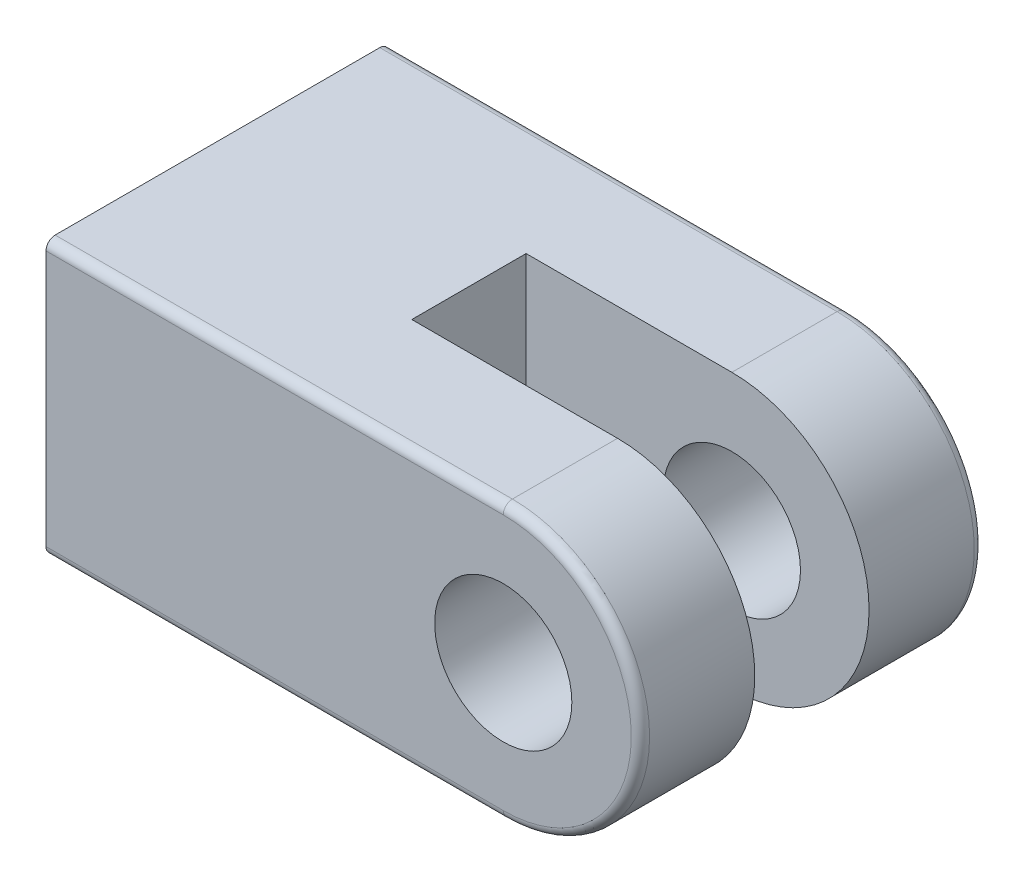
ISO-10303-21;
HEADER;
FILE_DESCRIPTION(('STEP AP214'),'2;1');
FILE_NAME('part.step','',(''),(''),'','','');
FILE_SCHEMA(('AUTOMOTIVE_DESIGN { 1 0 10303 214 1 1 1 1 }'));
ENDSEC;
DATA;
#1=APPLICATION_CONTEXT('core data for automotive mechanical design processes');
#2=APPLICATION_PROTOCOL_DEFINITION('international standard','automotive_design',2000,#1);
#3=PRODUCT_CONTEXT('',#1,'mechanical');
#4=PRODUCT('Part','Part','',(#3));
#5=PRODUCT_RELATED_PRODUCT_CATEGORY('part','',(#4));
#6=PRODUCT_DEFINITION_FORMATION('','',#4);
#7=PRODUCT_DEFINITION_CONTEXT('part definition',#1,'design');
#8=PRODUCT_DEFINITION('design','',#6,#7);
#9=PRODUCT_DEFINITION_SHAPE('','',#8);
#10=(LENGTH_UNIT() NAMED_UNIT(*) SI_UNIT(.MILLI.,.METRE.));
#11=(NAMED_UNIT(*) PLANE_ANGLE_UNIT() SI_UNIT($,.RADIAN.));
#12=(NAMED_UNIT(*) SI_UNIT($,.STERADIAN.) SOLID_ANGLE_UNIT());
#13=UNCERTAINTY_MEASURE_WITH_UNIT(LENGTH_MEASURE(1.E-05),#10,'distance_accuracy_value','');
#14=(GEOMETRIC_REPRESENTATION_CONTEXT(3) GLOBAL_UNCERTAINTY_ASSIGNED_CONTEXT((#13)) GLOBAL_UNIT_ASSIGNED_CONTEXT((#10,
#11,#12)) REPRESENTATION_CONTEXT('',''));
#15=CARTESIAN_POINT('',(0.,0.,0.));
#16=DIRECTION('',(0.,0.,1.));
#17=DIRECTION('',(1.,0.,0.));
#18=AXIS2_PLACEMENT_3D('',#15,#16,#17);
#19=CARTESIAN_POINT('',(0.,0.,19.05));
#20=DIRECTION('',(0.,0.,-1.));
#21=DIRECTION('',(-1.,0.,0.));
#22=AXIS2_PLACEMENT_3D('',#19,#20,#21);
#23=CYLINDRICAL_SURFACE('',#22,7.62);
#24=DIRECTION('',(0.,0.,-1.));
#25=VECTOR('',#24,1.);
#26=CARTESIAN_POINT('',(0.,7.62,19.05));
#27=LINE('',#26,#25);
#28=CARTESIAN_POINT('',(0.,7.62,18.542));
#29=VERTEX_POINT('',#28);
#30=CARTESIAN_POINT('',(0.,7.62,12.7));
#31=VERTEX_POINT('',#30);
#32=EDGE_CURVE('E193',#29,#31,#27,.T.);
#33=ORIENTED_EDGE('',*,*,#32,.F.);
#34=CARTESIAN_POINT('',(0.,0.,18.542));
#35=DIRECTION('',(0.,0.,1.));
#36=DIRECTION('',(1.,0.,0.));
#37=AXIS2_PLACEMENT_3D('',#34,#35,#36);
#38=CIRCLE('',#37,7.62);
#39=CARTESIAN_POINT('',(0.,-7.62,18.542));
#40=VERTEX_POINT('',#39);
#41=EDGE_CURVE('E13',#29,#40,#38,.F.);
#42=ORIENTED_EDGE('',*,*,#41,.T.);
#43=DIRECTION('',(0.,0.,-1.));
#44=VECTOR('',#43,1.);
#45=CARTESIAN_POINT('',(0.,-7.62,19.05));
#46=LINE('',#45,#44);
#47=CARTESIAN_POINT('',(0.,-7.62,12.7));
#48=VERTEX_POINT('',#47);
#49=EDGE_CURVE('E184',#40,#48,#46,.T.);
#50=ORIENTED_EDGE('',*,*,#49,.T.);
#51=CARTESIAN_POINT('',(0.,0.,12.7));
#52=DIRECTION('',(0.,0.,1.));
#53=DIRECTION('',(1.,0.,0.));
#54=AXIS2_PLACEMENT_3D('',#51,#52,#53);
#55=CIRCLE('',#54,7.62);
#56=EDGE_CURVE('E174',#48,#31,#55,.T.);
#57=ORIENTED_EDGE('',*,*,#56,.T.);
#58=EDGE_LOOP('',(#33,#42,#50,#57));
#59=FACE_BOUND('',#58,.T.);
#60=ADVANCED_FACE('F47',(#59),#23,.T.);
#61=CARTESIAN_POINT('',(0.,-7.62,6.35));
#62=VERTEX_POINT('',#61);
#63=CARTESIAN_POINT('',(0.,-7.62,0.508000000000008));
#64=VERTEX_POINT('',#63);
#65=EDGE_CURVE('E181',#62,#64,#46,.T.);
#66=ORIENTED_EDGE('',*,*,#65,.T.);
#67=CARTESIAN_POINT('',(0.,0.,0.508000000000002));
#68=DIRECTION('',(0.,0.,1.));
#69=DIRECTION('',(1.,0.,0.));
#70=AXIS2_PLACEMENT_3D('',#67,#68,#69);
#71=CIRCLE('',#70,7.62);
#72=CARTESIAN_POINT('',(0.,7.62,0.508000000000008));
#73=VERTEX_POINT('',#72);
#74=EDGE_CURVE('E56',#64,#73,#71,.T.);
#75=ORIENTED_EDGE('',*,*,#74,.T.);
#76=CARTESIAN_POINT('',(0.,7.62,6.35));
#77=VERTEX_POINT('',#76);
#78=EDGE_CURVE('E192',#77,#73,#27,.T.);
#79=ORIENTED_EDGE('',*,*,#78,.F.);
#80=CARTESIAN_POINT('',(0.,0.,6.35));
#81=DIRECTION('',(0.,0.,-1.));
#82=DIRECTION('',(-1.,0.,0.));
#83=AXIS2_PLACEMENT_3D('',#80,#81,#82);
#84=CIRCLE('',#83,7.62);
#85=EDGE_CURVE('E145',#77,#62,#84,.T.);
#86=ORIENTED_EDGE('',*,*,#85,.T.);
#87=EDGE_LOOP('',(#66,#75,#79,#86));
#88=FACE_BOUND('',#87,.T.);
#89=ADVANCED_FACE('F265',(#88),#23,.T.);
#90=CARTESIAN_POINT('',(0.,7.62,19.05));
#91=DIRECTION('',(0.,-1.,0.));
#92=DIRECTION('',(1.,0.,0.));
#93=AXIS2_PLACEMENT_3D('',#90,#91,#92);
#94=PLANE('',#93);
#95=ORIENTED_EDGE('',*,*,#78,.T.);
#96=DIRECTION('',(-1.,0.,0.));
#97=VECTOR('',#96,1.);
#98=CARTESIAN_POINT('',(0.,7.62,0.508000000000002));
#99=LINE('',#98,#97);
#100=CARTESIAN_POINT('',(-25.4,7.62,0.508000000000008));
#101=VERTEX_POINT('',#100);
#102=EDGE_CURVE('E222',#73,#101,#99,.T.);
#103=ORIENTED_EDGE('',*,*,#102,.T.);
#104=DIRECTION('',(0.,0.,-1.));
#105=VECTOR('',#104,1.);
#106=CARTESIAN_POINT('',(-25.4,7.62,19.05));
#107=LINE('',#106,#105);
#108=CARTESIAN_POINT('',(-25.4,7.62,18.542));
#109=VERTEX_POINT('',#108);
#110=EDGE_CURVE('E189',#109,#101,#107,.T.);
#111=ORIENTED_EDGE('',*,*,#110,.F.);
#112=DIRECTION('',(-1.,0.,0.));
#113=VECTOR('',#112,1.);
#114=CARTESIAN_POINT('',(0.,7.62,18.542));
#115=LINE('',#114,#113);
#116=EDGE_CURVE('E220',#109,#29,#115,.F.);
#117=ORIENTED_EDGE('',*,*,#116,.T.);
#118=ORIENTED_EDGE('',*,*,#32,.T.);
#119=DIRECTION('',(1.,0.,0.));
#120=VECTOR('',#119,1.);
#121=CARTESIAN_POINT('',(-11.43,7.62,12.7));
#122=LINE('',#121,#120);
#123=CARTESIAN_POINT('',(-11.43,7.62,12.7));
#124=VERTEX_POINT('',#123);
#125=EDGE_CURVE('E164',#124,#31,#122,.T.);
#126=ORIENTED_EDGE('',*,*,#125,.F.);
#127=DIRECTION('',(0.,0.,1.));
#128=VECTOR('',#127,1.);
#129=CARTESIAN_POINT('',(-11.43,7.62,6.35));
#130=LINE('',#129,#128);
#131=CARTESIAN_POINT('',(-11.43,7.62,6.35));
#132=VERTEX_POINT('',#131);
#133=EDGE_CURVE('E150',#132,#124,#130,.T.);
#134=ORIENTED_EDGE('',*,*,#133,.F.);
#135=DIRECTION('',(-1.,0.,0.));
#136=VECTOR('',#135,1.);
#137=CARTESIAN_POINT('',(7.62,7.62,6.35));
#138=LINE('',#137,#136);
#139=EDGE_CURVE('E139',#77,#132,#138,.T.);
#140=ORIENTED_EDGE('',*,*,#139,.F.);
#141=EDGE_LOOP('',(#95,#103,#111,#117,#118,#126,#134,#140));
#142=FACE_BOUND('',#141,.T.);
#143=ADVANCED_FACE('F162',(#142),#94,.F.);
#144=CARTESIAN_POINT('',(-25.4,7.62,19.05));
#145=DIRECTION('',(1.,0.,0.));
#146=DIRECTION('',(0.,0.,-1.));
#147=AXIS2_PLACEMENT_3D('',#144,#145,#146);
#148=PLANE('',#147);
#149=DIRECTION('',(0.,-1.,0.));
#150=VECTOR('',#149,1.);
#151=CARTESIAN_POINT('',(-25.4,7.62,0.));
#152=LINE('',#151,#150);
#153=CARTESIAN_POINT('',(-25.4,7.112,0.));
#154=VERTEX_POINT('',#153);
#155=CARTESIAN_POINT('',(-25.4,-7.112,0.));
#156=VERTEX_POINT('',#155);
#157=EDGE_CURVE('E177',#154,#156,#152,.T.);
#158=ORIENTED_EDGE('',*,*,#157,.T.);
#159=CARTESIAN_POINT('',(-25.4,-7.112,0.508000000000002));
#160=DIRECTION('',(1.,0.,0.));
#161=DIRECTION('',(0.,0.,-1.));
#162=AXIS2_PLACEMENT_3D('',#159,#160,#161);
#163=CIRCLE('',#162,0.508);
#164=CARTESIAN_POINT('',(-25.4,-7.62,0.508000000000008));
#165=VERTEX_POINT('',#164);
#166=EDGE_CURVE('E218',#156,#165,#163,.F.);
#167=ORIENTED_EDGE('',*,*,#166,.T.);
#168=DIRECTION('',(0.,0.,-1.));
#169=VECTOR('',#168,1.);
#170=CARTESIAN_POINT('',(-25.4,-7.62,19.05));
#171=LINE('',#170,#169);
#172=CARTESIAN_POINT('',(-25.4,-7.62,18.542));
#173=VERTEX_POINT('',#172);
#174=EDGE_CURVE('E186',#173,#165,#171,.T.);
#175=ORIENTED_EDGE('',*,*,#174,.F.);
#176=CARTESIAN_POINT('',(-25.4,-7.112,18.542));
#177=DIRECTION('',(1.,0.,0.));
#178=DIRECTION('',(0.,0.,-1.));
#179=AXIS2_PLACEMENT_3D('',#176,#177,#178);
#180=CIRCLE('',#179,0.508);
#181=CARTESIAN_POINT('',(-25.4,-7.112,19.05));
#182=VERTEX_POINT('',#181);
#183=EDGE_CURVE('E214',#173,#182,#180,.F.);
#184=ORIENTED_EDGE('',*,*,#183,.T.);
#185=DIRECTION('',(0.,-1.,0.));
#186=VECTOR('',#185,1.);
#187=CARTESIAN_POINT('',(-25.4,7.62,19.05));
#188=LINE('',#187,#186);
#189=CARTESIAN_POINT('',(-25.4,7.112,19.05));
#190=VERTEX_POINT('',#189);
#191=EDGE_CURVE('E178',#190,#182,#188,.T.);
#192=ORIENTED_EDGE('',*,*,#191,.F.);
#193=CARTESIAN_POINT('',(-25.4,7.112,18.542));
#194=DIRECTION('',(1.,0.,0.));
#195=DIRECTION('',(0.,0.,-1.));
#196=AXIS2_PLACEMENT_3D('',#193,#194,#195);
#197=CIRCLE('',#196,0.508);
#198=EDGE_CURVE('E212',#190,#109,#197,.F.);
#199=ORIENTED_EDGE('',*,*,#198,.T.);
#200=ORIENTED_EDGE('',*,*,#110,.T.);
#201=CARTESIAN_POINT('',(-25.4,7.112,0.508000000000002));
#202=DIRECTION('',(1.,0.,0.));
#203=DIRECTION('',(0.,0.,-1.));
#204=AXIS2_PLACEMENT_3D('',#201,#202,#203);
#205=CIRCLE('',#204,0.508);
#206=EDGE_CURVE('E216',#101,#154,#205,.F.);
#207=ORIENTED_EDGE('',*,*,#206,.T.);
#208=EDGE_LOOP('',(#158,#167,#175,#184,#192,#199,#200,#207));
#209=FACE_BOUND('',#208,.T.);
#210=ADVANCED_FACE('F247',(#209),#148,.F.);
#211=CARTESIAN_POINT('',(-25.4,-7.62,19.05));
#212=DIRECTION('',(0.,1.,0.));
#213=DIRECTION('',(0.,0.,1.));
#214=AXIS2_PLACEMENT_3D('',#211,#212,#213);
#215=PLANE('',#214);
#216=ORIENTED_EDGE('',*,*,#174,.T.);
#217=DIRECTION('',(1.,0.,0.));
#218=VECTOR('',#217,1.);
#219=CARTESIAN_POINT('',(-25.4,-7.62,0.508000000000002));
#220=LINE('',#219,#218);
#221=EDGE_CURVE('E203',#165,#64,#220,.T.);
#222=ORIENTED_EDGE('',*,*,#221,.T.);
#223=ORIENTED_EDGE('',*,*,#65,.F.);
#224=DIRECTION('',(-1.,0.,0.));
#225=VECTOR('',#224,1.);
#226=CARTESIAN_POINT('',(-25.4,-7.62,6.35));
#227=LINE('',#226,#225);
#228=CARTESIAN_POINT('',(-11.43,-7.62,6.35));
#229=VERTEX_POINT('',#228);
#230=EDGE_CURVE('E195',#62,#229,#227,.T.);
#231=ORIENTED_EDGE('',*,*,#230,.T.);
#232=DIRECTION('',(0.,0.,1.));
#233=VECTOR('',#232,1.);
#234=CARTESIAN_POINT('',(-11.43,-7.62,6.35));
#235=LINE('',#234,#233);
#236=CARTESIAN_POINT('',(-11.43,-7.62,12.7));
#237=VERTEX_POINT('',#236);
#238=EDGE_CURVE('E158',#229,#237,#235,.T.);
#239=ORIENTED_EDGE('',*,*,#238,.T.);
#240=DIRECTION('',(1.,0.,0.));
#241=VECTOR('',#240,1.);
#242=CARTESIAN_POINT('',(-11.43,-7.62,12.7));
#243=LINE('',#242,#241);
#244=EDGE_CURVE('E160',#237,#48,#243,.T.);
#245=ORIENTED_EDGE('',*,*,#244,.T.);
#246=ORIENTED_EDGE('',*,*,#49,.F.);
#247=DIRECTION('',(1.,0.,0.));
#248=VECTOR('',#247,1.);
#249=CARTESIAN_POINT('',(-25.4,-7.62,18.542));
#250=LINE('',#249,#248);
#251=EDGE_CURVE('E197',#40,#173,#250,.F.);
#252=ORIENTED_EDGE('',*,*,#251,.T.);
#253=EDGE_LOOP('',(#216,#222,#223,#231,#239,#245,#246,#252));
#254=FACE_BOUND('',#253,.T.);
#255=ADVANCED_FACE('F254',(#254),#215,.F.);
#256=CARTESIAN_POINT('',(0.,0.,19.05));
#257=DIRECTION('',(0.,0.,1.));
#258=DIRECTION('',(1.,0.,0.));
#259=AXIS2_PLACEMENT_3D('',#256,#257,#258);
#260=PLANE('',#259);
#261=ORIENTED_EDGE('',*,*,#191,.T.);
#262=DIRECTION('',(1.,0.,0.));
#263=VECTOR('',#262,1.);
#264=CARTESIAN_POINT('',(0.,-7.112,19.05));
#265=LINE('',#264,#263);
#266=CARTESIAN_POINT('',(0.,-7.112,19.05));
#267=VERTEX_POINT('',#266);
#268=EDGE_CURVE('E227',#182,#267,#265,.T.);
#269=ORIENTED_EDGE('',*,*,#268,.T.);
#270=CARTESIAN_POINT('',(0.,0.,19.05));
#271=DIRECTION('',(0.,0.,1.));
#272=DIRECTION('',(1.,0.,0.));
#273=AXIS2_PLACEMENT_3D('',#270,#271,#272);
#274=CIRCLE('',#273,7.112);
#275=CARTESIAN_POINT('',(0.,7.112,19.05));
#276=VERTEX_POINT('',#275);
#277=EDGE_CURVE('E64',#267,#276,#274,.T.);
#278=ORIENTED_EDGE('',*,*,#277,.T.);
#279=DIRECTION('',(-1.,0.,0.));
#280=VECTOR('',#279,1.);
#281=CARTESIAN_POINT('',(-25.4,7.112,19.05));
#282=LINE('',#281,#280);
#283=EDGE_CURVE('E225',#276,#190,#282,.T.);
#284=ORIENTED_EDGE('',*,*,#283,.T.);
#285=EDGE_LOOP('',(#261,#269,#278,#284));
#286=FACE_BOUND('',#285,.T.);
#287=CARTESIAN_POINT('',(0.,0.,19.05));
#288=DIRECTION('',(0.,0.,1.));
#289=DIRECTION('',(1.,0.,0.));
#290=AXIS2_PLACEMENT_3D('',#287,#288,#289);
#291=CIRCLE('',#290,3.81);
#292=CARTESIAN_POINT('',(3.81,0.,19.05));
#293=VERTEX_POINT('',#292);
#294=EDGE_CURVE('E234',#293,#293,#291,.T.);
#295=ORIENTED_EDGE('',*,*,#294,.F.);
#296=EDGE_LOOP('',(#295));
#297=FACE_BOUND('',#296,.T.);
#298=ADVANCED_FACE('F244',(#286,#297),#260,.T.);
#299=CARTESIAN_POINT('',(0.,0.,0.));
#300=DIRECTION('',(0.,0.,1.));
#301=DIRECTION('',(1.,0.,0.));
#302=AXIS2_PLACEMENT_3D('',#299,#300,#301);
#303=PLANE('',#302);
#304=CARTESIAN_POINT('',(0.,0.,0.));
#305=DIRECTION('',(0.,0.,1.));
#306=DIRECTION('',(1.,0.,0.));
#307=AXIS2_PLACEMENT_3D('',#304,#305,#306);
#308=CIRCLE('',#307,3.81);
#309=CARTESIAN_POINT('',(3.81,0.,0.));
#310=VERTEX_POINT('',#309);
#311=EDGE_CURVE('E201',#310,#310,#308,.T.);
#312=ORIENTED_EDGE('',*,*,#311,.T.);
#313=EDGE_LOOP('',(#312));
#314=FACE_BOUND('',#313,.T.);
#315=CARTESIAN_POINT('',(0.,0.,0.));
#316=DIRECTION('',(0.,0.,1.));
#317=DIRECTION('',(1.,0.,0.));
#318=AXIS2_PLACEMENT_3D('',#315,#316,#317);
#319=CIRCLE('',#318,7.112);
#320=CARTESIAN_POINT('',(0.,7.112,0.));
#321=VERTEX_POINT('',#320);
#322=CARTESIAN_POINT('',(0.,-7.112,0.));
#323=VERTEX_POINT('',#322);
#324=EDGE_CURVE('E206',#321,#323,#319,.F.);
#325=ORIENTED_EDGE('',*,*,#324,.T.);
#326=DIRECTION('',(1.,0.,0.));
#327=VECTOR('',#326,1.);
#328=CARTESIAN_POINT('',(0.,-7.112,0.));
#329=LINE('',#328,#327);
#330=EDGE_CURVE('E210',#323,#156,#329,.F.);
#331=ORIENTED_EDGE('',*,*,#330,.T.);
#332=ORIENTED_EDGE('',*,*,#157,.F.);
#333=DIRECTION('',(-1.,0.,0.));
#334=VECTOR('',#333,1.);
#335=CARTESIAN_POINT('',(0.,7.112,0.));
#336=LINE('',#335,#334);
#337=EDGE_CURVE('E208',#154,#321,#336,.F.);
#338=ORIENTED_EDGE('',*,*,#337,.T.);
#339=EDGE_LOOP('',(#325,#331,#332,#338));
#340=FACE_BOUND('',#339,.T.);
#341=ADVANCED_FACE('F279',(#314,#340),#303,.F.);
#342=CARTESIAN_POINT('',(-11.43,-7.62,12.7));
#343=DIRECTION('',(0.,0.,1.));
#344=DIRECTION('',(1.,0.,0.));
#345=AXIS2_PLACEMENT_3D('',#342,#343,#344);
#346=PLANE('',#345);
#347=CARTESIAN_POINT('',(0.,0.,12.7));
#348=DIRECTION('',(0.,0.,1.));
#349=DIRECTION('',(1.,0.,0.));
#350=AXIS2_PLACEMENT_3D('',#347,#348,#349);
#351=CIRCLE('',#350,3.81);
#352=CARTESIAN_POINT('',(3.81,0.,12.7));
#353=VERTEX_POINT('',#352);
#354=EDGE_CURVE('E151',#353,#353,#351,.T.);
#355=ORIENTED_EDGE('',*,*,#354,.T.);
#356=EDGE_LOOP('',(#355));
#357=FACE_BOUND('',#356,.T.);
#358=ORIENTED_EDGE('',*,*,#56,.F.);
#359=ORIENTED_EDGE('',*,*,#244,.F.);
#360=DIRECTION('',(0.,1.,0.));
#361=VECTOR('',#360,1.);
#362=CARTESIAN_POINT('',(-11.43,-7.62,12.7));
#363=LINE('',#362,#361);
#364=EDGE_CURVE('E159',#237,#124,#363,.T.);
#365=ORIENTED_EDGE('',*,*,#364,.T.);
#366=ORIENTED_EDGE('',*,*,#125,.T.);
#367=EDGE_LOOP('',(#358,#359,#365,#366));
#368=FACE_BOUND('',#367,.T.);
#369=ADVANCED_FACE('F261',(#357,#368),#346,.F.);
#370=CARTESIAN_POINT('',(7.62,-7.62,6.35));
#371=DIRECTION('',(0.,0.,-1.));
#372=DIRECTION('',(-1.,0.,0.));
#373=AXIS2_PLACEMENT_3D('',#370,#371,#372);
#374=PLANE('',#373);
#375=CARTESIAN_POINT('',(0.,0.,6.35));
#376=DIRECTION('',(0.,0.,-1.));
#377=DIRECTION('',(-1.,0.,0.));
#378=AXIS2_PLACEMENT_3D('',#375,#376,#377);
#379=CIRCLE('',#378,3.81);
#380=CARTESIAN_POINT('',(3.81,0.,6.35));
#381=VERTEX_POINT('',#380);
#382=EDGE_CURVE('E198',#381,#381,#379,.T.);
#383=ORIENTED_EDGE('',*,*,#382,.T.);
#384=EDGE_LOOP('',(#383));
#385=FACE_BOUND('',#384,.T.);
#386=ORIENTED_EDGE('',*,*,#139,.T.);
#387=DIRECTION('',(0.,1.,0.));
#388=VECTOR('',#387,1.);
#389=CARTESIAN_POINT('',(-11.43,-7.62,6.35));
#390=LINE('',#389,#388);
#391=EDGE_CURVE('E143',#229,#132,#390,.T.);
#392=ORIENTED_EDGE('',*,*,#391,.F.);
#393=ORIENTED_EDGE('',*,*,#230,.F.);
#394=ORIENTED_EDGE('',*,*,#85,.F.);
#395=EDGE_LOOP('',(#386,#392,#393,#394));
#396=FACE_BOUND('',#395,.T.);
#397=ADVANCED_FACE('F141',(#385,#396),#374,.F.);
#398=CARTESIAN_POINT('',(-11.43,-7.62,6.35));
#399=DIRECTION('',(-1.,0.,0.));
#400=DIRECTION('',(0.,0.,1.));
#401=AXIS2_PLACEMENT_3D('',#398,#399,#400);
#402=PLANE('',#401);
#403=ORIENTED_EDGE('',*,*,#364,.F.);
#404=ORIENTED_EDGE('',*,*,#238,.F.);
#405=ORIENTED_EDGE('',*,*,#391,.T.);
#406=ORIENTED_EDGE('',*,*,#133,.T.);
#407=EDGE_LOOP('',(#403,#404,#405,#406));
#408=FACE_BOUND('',#407,.T.);
#409=ADVANCED_FACE('F155',(#408),#402,.F.);
#410=CARTESIAN_POINT('',(0.,0.,0.));
#411=DIRECTION('',(0.,0.,1.));
#412=DIRECTION('',(1.,0.,0.));
#413=AXIS2_PLACEMENT_3D('',#410,#411,#412);
#414=CYLINDRICAL_SURFACE('',#413,3.81);
#415=CARTESIAN_POINT('',(3.81,0.,0.));
#416=CARTESIAN_POINT('',(3.81,0.,0.0661458333333333));
#417=CARTESIAN_POINT('',(3.81,0.,0.132291666666667));
#418=CARTESIAN_POINT('',(3.81,0.,0.264583333333333));
#419=CARTESIAN_POINT('',(3.81,0.,0.330729166666667));
#420=CARTESIAN_POINT('',(3.81,0.,0.463020833333333));
#421=CARTESIAN_POINT('',(3.81,0.,0.529166666666667));
#422=CARTESIAN_POINT('',(3.81,0.,0.661458333333333));
#423=CARTESIAN_POINT('',(3.81,0.,0.727604166666667));
#424=CARTESIAN_POINT('',(3.81,0.,0.859895833333333));
#425=CARTESIAN_POINT('',(3.81,0.,0.926041666666667));
#426=CARTESIAN_POINT('',(3.81,0.,1.05833333333333));
#427=CARTESIAN_POINT('',(3.81,0.,1.12447916666667));
#428=CARTESIAN_POINT('',(3.81,0.,1.25677083333333));
#429=CARTESIAN_POINT('',(3.81,0.,1.32291666666667));
#430=CARTESIAN_POINT('',(3.81,0.,1.45520833333333));
#431=CARTESIAN_POINT('',(3.81,0.,1.52135416666667));
#432=CARTESIAN_POINT('',(3.81,0.,1.65364583333333));
#433=CARTESIAN_POINT('',(3.81,0.,1.71979166666667));
#434=CARTESIAN_POINT('',(3.81,0.,1.85208333333333));
#435=CARTESIAN_POINT('',(3.81,0.,1.91822916666667));
#436=CARTESIAN_POINT('',(3.81,0.,2.05052083333333));
#437=CARTESIAN_POINT('',(3.81,0.,2.11666666666667));
#438=CARTESIAN_POINT('',(3.81,0.,2.24895833333333));
#439=CARTESIAN_POINT('',(3.81,0.,2.31510416666667));
#440=CARTESIAN_POINT('',(3.81,0.,2.44739583333333));
#441=CARTESIAN_POINT('',(3.81,0.,2.51354166666667));
#442=CARTESIAN_POINT('',(3.81,0.,2.64583333333333));
#443=CARTESIAN_POINT('',(3.81,0.,2.71197916666667));
#444=CARTESIAN_POINT('',(3.81,0.,2.84427083333333));
#445=CARTESIAN_POINT('',(3.81,0.,2.91041666666667));
#446=CARTESIAN_POINT('',(3.81,0.,3.04270833333333));
#447=CARTESIAN_POINT('',(3.81,0.,3.10885416666667));
#448=CARTESIAN_POINT('',(3.81,0.,3.24114583333333));
#449=CARTESIAN_POINT('',(3.81,0.,3.30729166666667));
#450=CARTESIAN_POINT('',(3.81,0.,3.43958333333333));
#451=CARTESIAN_POINT('',(3.81,0.,3.50572916666667));
#452=CARTESIAN_POINT('',(3.81,0.,3.63802083333333));
#453=CARTESIAN_POINT('',(3.81,0.,3.70416666666667));
#454=CARTESIAN_POINT('',(3.81,0.,3.83645833333333));
#455=CARTESIAN_POINT('',(3.81,0.,3.90260416666667));
#456=CARTESIAN_POINT('',(3.81,0.,4.03489583333333));
#457=CARTESIAN_POINT('',(3.81,0.,4.10104166666667));
#458=CARTESIAN_POINT('',(3.81,0.,4.23333333333333));
#459=CARTESIAN_POINT('',(3.81,0.,4.29947916666667));
#460=CARTESIAN_POINT('',(3.81,0.,4.43177083333333));
#461=CARTESIAN_POINT('',(3.81,0.,4.49791666666667));
#462=CARTESIAN_POINT('',(3.81,0.,4.63020833333333));
#463=CARTESIAN_POINT('',(3.81,0.,4.69635416666667));
#464=CARTESIAN_POINT('',(3.81,0.,4.82864583333333));
#465=CARTESIAN_POINT('',(3.81,0.,4.89479166666667));
#466=CARTESIAN_POINT('',(3.81,0.,5.02708333333333));
#467=CARTESIAN_POINT('',(3.81,0.,5.09322916666667));
#468=CARTESIAN_POINT('',(3.81,0.,5.22552083333333));
#469=CARTESIAN_POINT('',(3.81,0.,5.29166666666667));
#470=CARTESIAN_POINT('',(3.81,0.,5.42395833333333));
#471=CARTESIAN_POINT('',(3.81,0.,5.49010416666667));
#472=CARTESIAN_POINT('',(3.81,0.,5.62239583333333));
#473=CARTESIAN_POINT('',(3.81,0.,5.68854166666667));
#474=CARTESIAN_POINT('',(3.81,0.,5.82083333333333));
#475=CARTESIAN_POINT('',(3.81,0.,5.88697916666667));
#476=CARTESIAN_POINT('',(3.81,0.,6.01927083333333));
#477=CARTESIAN_POINT('',(3.81,0.,6.08541666666667));
#478=CARTESIAN_POINT('',(3.81,0.,6.21770833333333));
#479=CARTESIAN_POINT('',(3.81,0.,6.28385416666667));
#480=CARTESIAN_POINT('',(3.81,0.,6.35));
#481=B_SPLINE_CURVE_WITH_KNOTS('',3,(#415,#416,#417,#418,#419,#420,#421,#422,#423,#424,#425,
#426,#427,#428,#429,#430,#431,#432,#433,#434,#435,#436,#437,#438,#439,#440,#441,#442,#443,#444,
#445,#446,#447,#448,#449,#450,#451,#452,#453,#454,#455,#456,#457,#458,#459,#460,#461,#462,#463,
#464,#465,#466,#467,#468,#469,#470,#471,#472,#473,#474,#475,#476,#477,#478,#479,#480),
.UNSPECIFIED.,.F.,.F.,(4,2,2,2,2,2,2,2,2,2,2,2,2,2,2,2,2,2,2,2,2,2,2,2,2,2,2,2,2,2,2,2,4),(0.,
0.1984375,0.396875,0.5953125,0.79375,0.9921875,1.190625,1.3890625,1.5875,1.7859375,1.984375,
2.1828125,2.38125,2.5796875,2.778125,2.9765625,3.175,3.3734375,3.571875,3.7703125,3.96875,
4.1671875,4.365625,4.5640625,4.7625,4.9609375,5.159375,5.3578125,5.55625,5.7546875,5.953125,
6.1515625,6.35),.UNSPECIFIED.);
#482=EDGE_CURVE('BSEAM313',#310,#381,#481,.T.);
#483=ORIENTED_EDGE('',*,*,#311,.F.);
#484=ORIENTED_EDGE('',*,*,#382,.F.);
#485=ORIENTED_EDGE('',*,*,#482,.T.);
#486=ORIENTED_EDGE('',*,*,#482,.F.);
#487=EDGE_LOOP('',(#483,#485,#484,#486));
#488=FACE_BOUND('',#487,.T.);
#489=ADVANCED_FACE('F313',(#488),#414,.F.);
#490=CARTESIAN_POINT('',(3.81,0.,19.05));
#491=CARTESIAN_POINT('',(3.81,0.,18.9838541666667));
#492=CARTESIAN_POINT('',(3.81,0.,18.9177083333333));
#493=CARTESIAN_POINT('',(3.81,0.,18.7854166666667));
#494=CARTESIAN_POINT('',(3.81,0.,18.7192708333333));
#495=CARTESIAN_POINT('',(3.81,0.,18.5869791666667));
#496=CARTESIAN_POINT('',(3.81,0.,18.5208333333333));
#497=CARTESIAN_POINT('',(3.81,0.,18.3885416666667));
#498=CARTESIAN_POINT('',(3.81,0.,18.3223958333333));
#499=CARTESIAN_POINT('',(3.81,0.,18.1901041666667));
#500=CARTESIAN_POINT('',(3.81,0.,18.1239583333333));
#501=CARTESIAN_POINT('',(3.81,0.,17.9916666666667));
#502=CARTESIAN_POINT('',(3.81,0.,17.9255208333333));
#503=CARTESIAN_POINT('',(3.81,0.,17.7932291666667));
#504=CARTESIAN_POINT('',(3.81,0.,17.7270833333333));
#505=CARTESIAN_POINT('',(3.81,0.,17.5947916666667));
#506=CARTESIAN_POINT('',(3.81,0.,17.5286458333333));
#507=CARTESIAN_POINT('',(3.81,0.,17.3963541666667));
#508=CARTESIAN_POINT('',(3.81,0.,17.3302083333333));
#509=CARTESIAN_POINT('',(3.81,0.,17.1979166666667));
#510=CARTESIAN_POINT('',(3.81,0.,17.1317708333333));
#511=CARTESIAN_POINT('',(3.81,0.,16.9994791666667));
#512=CARTESIAN_POINT('',(3.81,0.,16.9333333333333));
#513=CARTESIAN_POINT('',(3.81,0.,16.8010416666667));
#514=CARTESIAN_POINT('',(3.81,0.,16.7348958333333));
#515=CARTESIAN_POINT('',(3.81,0.,16.6026041666667));
#516=CARTESIAN_POINT('',(3.81,0.,16.5364583333333));
#517=CARTESIAN_POINT('',(3.81,0.,16.4041666666667));
#518=CARTESIAN_POINT('',(3.81,0.,16.3380208333333));
#519=CARTESIAN_POINT('',(3.81,0.,16.2057291666667));
#520=CARTESIAN_POINT('',(3.81,0.,16.1395833333333));
#521=CARTESIAN_POINT('',(3.81,0.,16.0072916666667));
#522=CARTESIAN_POINT('',(3.81,0.,15.9411458333333));
#523=CARTESIAN_POINT('',(3.81,0.,15.8088541666667));
#524=CARTESIAN_POINT('',(3.81,0.,15.7427083333333));
#525=CARTESIAN_POINT('',(3.81,0.,15.6104166666667));
#526=CARTESIAN_POINT('',(3.81,0.,15.5442708333333));
#527=CARTESIAN_POINT('',(3.81,0.,15.4119791666667));
#528=CARTESIAN_POINT('',(3.81,0.,15.3458333333333));
#529=CARTESIAN_POINT('',(3.81,0.,15.2135416666667));
#530=CARTESIAN_POINT('',(3.81,0.,15.1473958333333));
#531=CARTESIAN_POINT('',(3.81,0.,15.0151041666667));
#532=CARTESIAN_POINT('',(3.81,0.,14.9489583333333));
#533=CARTESIAN_POINT('',(3.81,0.,14.8166666666667));
#534=CARTESIAN_POINT('',(3.81,0.,14.7505208333333));
#535=CARTESIAN_POINT('',(3.81,0.,14.6182291666667));
#536=CARTESIAN_POINT('',(3.81,0.,14.5520833333333));
#537=CARTESIAN_POINT('',(3.81,0.,14.4197916666667));
#538=CARTESIAN_POINT('',(3.81,0.,14.3536458333333));
#539=CARTESIAN_POINT('',(3.81,0.,14.2213541666667));
#540=CARTESIAN_POINT('',(3.81,0.,14.1552083333333));
#541=CARTESIAN_POINT('',(3.81,0.,14.0229166666667));
#542=CARTESIAN_POINT('',(3.81,0.,13.9567708333333));
#543=CARTESIAN_POINT('',(3.81,0.,13.8244791666667));
#544=CARTESIAN_POINT('',(3.81,0.,13.7583333333333));
#545=CARTESIAN_POINT('',(3.81,0.,13.6260416666667));
#546=CARTESIAN_POINT('',(3.81,0.,13.5598958333333));
#547=CARTESIAN_POINT('',(3.81,0.,13.4276041666667));
#548=CARTESIAN_POINT('',(3.81,0.,13.3614583333333));
#549=CARTESIAN_POINT('',(3.81,0.,13.2291666666667));
#550=CARTESIAN_POINT('',(3.81,0.,13.1630208333333));
#551=CARTESIAN_POINT('',(3.81,0.,13.0307291666667));
#552=CARTESIAN_POINT('',(3.81,0.,12.9645833333333));
#553=CARTESIAN_POINT('',(3.81,0.,12.8322916666667));
#554=CARTESIAN_POINT('',(3.81,0.,12.7661458333333));
#555=CARTESIAN_POINT('',(3.81,0.,12.7));
#556=B_SPLINE_CURVE_WITH_KNOTS('',3,(#490,#491,#492,#493,#494,#495,#496,#497,#498,#499,#500,
#501,#502,#503,#504,#505,#506,#507,#508,#509,#510,#511,#512,#513,#514,#515,#516,#517,#518,#519,
#520,#521,#522,#523,#524,#525,#526,#527,#528,#529,#530,#531,#532,#533,#534,#535,#536,#537,#538,
#539,#540,#541,#542,#543,#544,#545,#546,#547,#548,#549,#550,#551,#552,#553,#554,#555),
.UNSPECIFIED.,.F.,.F.,(4,2,2,2,2,2,2,2,2,2,2,2,2,2,2,2,2,2,2,2,2,2,2,2,2,2,2,2,2,2,2,2,4),(0.,
0.198437499999999,0.396875000000001,0.5953125,0.793749999999999,0.992187500000002,1.190625,
1.3890625,1.5875,1.7859375,1.984375,2.1828125,2.38125,2.5796875,2.778125,2.9765625,3.175,
3.3734375,3.571875,3.7703125,3.96875,4.1671875,4.365625,4.5640625,4.7625,4.9609375,5.159375,
5.3578125,5.55625,5.7546875,5.953125,6.1515625,6.35),.UNSPECIFIED.);
#557=EDGE_CURVE('BSEAM317',#293,#353,#556,.T.);
#558=ORIENTED_EDGE('',*,*,#294,.T.);
#559=ORIENTED_EDGE('',*,*,#354,.F.);
#560=ORIENTED_EDGE('',*,*,#557,.T.);
#561=ORIENTED_EDGE('',*,*,#557,.F.);
#562=EDGE_LOOP('',(#558,#560,#559,#561));
#563=FACE_BOUND('',#562,.T.);
#564=ADVANCED_FACE('F317',(#563),#414,.F.);
#565=CARTESIAN_POINT('',(0.,7.112,0.508000000000002));
#566=DIRECTION('',(-1.,0.,0.));
#567=DIRECTION('',(0.,-1.,0.));
#568=AXIS2_PLACEMENT_3D('',#565,#566,#567);
#569=CYLINDRICAL_SURFACE('',#568,0.508);
#570=ORIENTED_EDGE('',*,*,#206,.F.);
#571=ORIENTED_EDGE('',*,*,#102,.F.);
#572=CARTESIAN_POINT('',(0.,7.112,0.508));
#573=DIRECTION('',(1.,0.,0.));
#574=DIRECTION('',(0.,1.,0.));
#575=AXIS2_PLACEMENT_3D('',#572,#573,#574);
#576=CIRCLE('',#575,0.508);
#577=EDGE_CURVE('E232',#321,#73,#576,.T.);
#578=ORIENTED_EDGE('',*,*,#577,.F.);
#579=ORIENTED_EDGE('',*,*,#337,.F.);
#580=EDGE_LOOP('',(#570,#571,#578,#579));
#581=FACE_BOUND('',#580,.T.);
#582=ADVANCED_FACE('F271',(#581),#569,.T.);
#583=CARTESIAN_POINT('',(0.,0.,0.508000000000002));
#584=DIRECTION('',(0.,0.,1.));
#585=DIRECTION('',(1.,0.,0.));
#586=AXIS2_PLACEMENT_3D('',#583,#584,#585);
#587=TOROIDAL_SURFACE('',#586,7.112,0.508);
#588=ORIENTED_EDGE('',*,*,#577,.T.);
#589=ORIENTED_EDGE('',*,*,#74,.F.);
#590=CARTESIAN_POINT('',(0.,-7.112,0.508));
#591=DIRECTION('',(-1.,0.,0.));
#592=DIRECTION('',(0.,0.,1.));
#593=AXIS2_PLACEMENT_3D('',#590,#591,#592);
#594=CIRCLE('',#593,0.508);
#595=EDGE_CURVE('E230',#323,#64,#594,.T.);
#596=ORIENTED_EDGE('',*,*,#595,.F.);
#597=ORIENTED_EDGE('',*,*,#324,.F.);
#598=EDGE_LOOP('',(#588,#589,#596,#597));
#599=FACE_BOUND('',#598,.T.);
#600=ADVANCED_FACE('F275',(#599),#587,.T.);
#601=CARTESIAN_POINT('',(-25.4,-7.112,0.508000000000002));
#602=DIRECTION('',(1.,0.,0.));
#603=DIRECTION('',(0.,0.,-1.));
#604=AXIS2_PLACEMENT_3D('',#601,#602,#603);
#605=CYLINDRICAL_SURFACE('',#604,0.508);
#606=ORIENTED_EDGE('',*,*,#166,.F.);
#607=ORIENTED_EDGE('',*,*,#330,.F.);
#608=ORIENTED_EDGE('',*,*,#595,.T.);
#609=ORIENTED_EDGE('',*,*,#221,.F.);
#610=EDGE_LOOP('',(#606,#607,#608,#609));
#611=FACE_BOUND('',#610,.T.);
#612=ADVANCED_FACE('F283',(#611),#605,.T.);
#613=CARTESIAN_POINT('',(0.,7.112,18.542));
#614=DIRECTION('',(1.,0.,0.));
#615=DIRECTION('',(0.,1.,0.));
#616=AXIS2_PLACEMENT_3D('',#613,#614,#615);
#617=CYLINDRICAL_SURFACE('',#616,0.508);
#618=ORIENTED_EDGE('',*,*,#198,.F.);
#619=ORIENTED_EDGE('',*,*,#283,.F.);
#620=CARTESIAN_POINT('',(0.,7.112,18.542));
#621=DIRECTION('',(1.,0.,0.));
#622=DIRECTION('',(0.,1.,0.));
#623=AXIS2_PLACEMENT_3D('',#620,#621,#622);
#624=CIRCLE('',#623,0.508);
#625=EDGE_CURVE('E51',#29,#276,#624,.T.);
#626=ORIENTED_EDGE('',*,*,#625,.F.);
#627=ORIENTED_EDGE('',*,*,#116,.F.);
#628=EDGE_LOOP('',(#618,#619,#626,#627));
#629=FACE_BOUND('',#628,.T.);
#630=ADVANCED_FACE('F49',(#629),#617,.T.);
#631=CARTESIAN_POINT('',(0.,0.,18.542));
#632=DIRECTION('',(0.,0.,1.));
#633=DIRECTION('',(1.,0.,0.));
#634=AXIS2_PLACEMENT_3D('',#631,#632,#633);
#635=TOROIDAL_SURFACE('',#634,7.112,0.508);
#636=ORIENTED_EDGE('',*,*,#625,.T.);
#637=ORIENTED_EDGE('',*,*,#277,.F.);
#638=CARTESIAN_POINT('',(0.,-7.112,18.542));
#639=DIRECTION('',(-1.,0.,0.));
#640=DIRECTION('',(0.,0.,1.));
#641=AXIS2_PLACEMENT_3D('',#638,#639,#640);
#642=CIRCLE('',#641,0.508);
#643=EDGE_CURVE('E72',#40,#267,#642,.T.);
#644=ORIENTED_EDGE('',*,*,#643,.F.);
#645=ORIENTED_EDGE('',*,*,#41,.F.);
#646=EDGE_LOOP('',(#636,#637,#644,#645));
#647=FACE_BOUND('',#646,.T.);
#648=ADVANCED_FACE('F239',(#647),#635,.T.);
#649=CARTESIAN_POINT('',(0.,-7.112,18.542));
#650=DIRECTION('',(-1.,0.,0.));
#651=DIRECTION('',(0.,0.,1.));
#652=AXIS2_PLACEMENT_3D('',#649,#650,#651);
#653=CYLINDRICAL_SURFACE('',#652,0.508);
#654=ORIENTED_EDGE('',*,*,#183,.F.);
#655=ORIENTED_EDGE('',*,*,#251,.F.);
#656=ORIENTED_EDGE('',*,*,#643,.T.);
#657=ORIENTED_EDGE('',*,*,#268,.F.);
#658=EDGE_LOOP('',(#654,#655,#656,#657));
#659=FACE_BOUND('',#658,.T.);
#660=ADVANCED_FACE('F251',(#659),#653,.T.);
#661=CLOSED_SHELL('',(#60,#89,#143,#210,#255,#298,#341,#369,#397,#409,#489,#564,#582,#600,#612,
#630,#648,#660));
#662=MANIFOLD_SOLID_BREP('B2',#661);
#663=ADVANCED_BREP_SHAPE_REPRESENTATION('',(#18,#662),#14);
#664=SHAPE_DEFINITION_REPRESENTATION(#9,#663);
ENDSEC;
END-ISO-10303-21;
